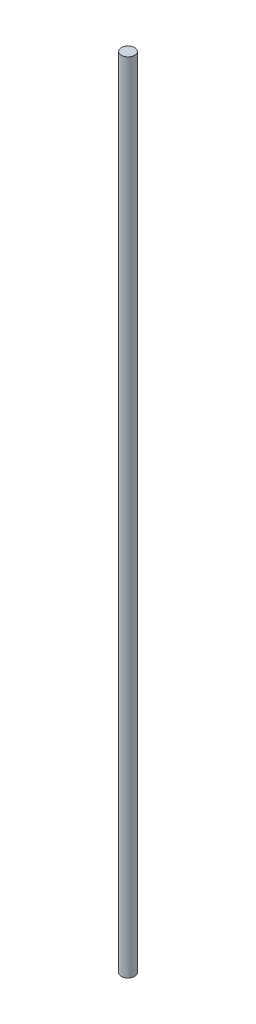
ISO-10303-21;
HEADER;
FILE_DESCRIPTION(('STEP AP214'),'2;1');
FILE_NAME('part.step','',(''),(''),'','','');
FILE_SCHEMA(('AUTOMOTIVE_DESIGN { 1 0 10303 214 1 1 1 1 }'));
ENDSEC;
DATA;
#1=APPLICATION_CONTEXT('core data for automotive mechanical design processes');
#2=APPLICATION_PROTOCOL_DEFINITION('international standard','automotive_design',2000,#1);
#3=PRODUCT_CONTEXT('',#1,'mechanical');
#4=PRODUCT('Part','Part','',(#3));
#5=PRODUCT_RELATED_PRODUCT_CATEGORY('part','',(#4));
#6=PRODUCT_DEFINITION_FORMATION('','',#4);
#7=PRODUCT_DEFINITION_CONTEXT('part definition',#1,'design');
#8=PRODUCT_DEFINITION('design','',#6,#7);
#9=PRODUCT_DEFINITION_SHAPE('','',#8);
#10=(LENGTH_UNIT() NAMED_UNIT(*) SI_UNIT(.MILLI.,.METRE.));
#11=(NAMED_UNIT(*) PLANE_ANGLE_UNIT() SI_UNIT($,.RADIAN.));
#12=(NAMED_UNIT(*) SI_UNIT($,.STERADIAN.) SOLID_ANGLE_UNIT());
#13=UNCERTAINTY_MEASURE_WITH_UNIT(LENGTH_MEASURE(1.E-05),#10,'distance_accuracy_value','');
#14=(GEOMETRIC_REPRESENTATION_CONTEXT(3) GLOBAL_UNCERTAINTY_ASSIGNED_CONTEXT((#13)) GLOBAL_UNIT_ASSIGNED_CONTEXT((#10,
#11,#12)) REPRESENTATION_CONTEXT('',''));
#15=CARTESIAN_POINT('',(0.,0.,0.));
#16=DIRECTION('',(0.,0.,1.));
#17=DIRECTION('',(1.,0.,0.));
#18=AXIS2_PLACEMENT_3D('',#15,#16,#17);
#19=CARTESIAN_POINT('',(0.,12.,0.));
#20=DIRECTION('',(0.,-1.,0.));
#21=DIRECTION('',(0.,0.,-1.));
#22=AXIS2_PLACEMENT_3D('',#19,#20,#21);
#23=CYLINDRICAL_SURFACE('',#22,0.1);
#24=CARTESIAN_POINT('',(0.,12.,0.));
#25=DIRECTION('',(0.,1.,0.));
#26=DIRECTION('',(0.,0.,1.));
#27=AXIS2_PLACEMENT_3D('',#24,#25,#26);
#28=CIRCLE('',#27,0.1);
#29=CARTESIAN_POINT('',(0.,12.,0.1));
#30=VERTEX_POINT('',#29);
#31=EDGE_CURVE('E12',#30,#30,#28,.T.);
#32=ORIENTED_EDGE('',*,*,#31,.F.);
#33=EDGE_LOOP('',(#32));
#34=FACE_BOUND('',#33,.T.);
#35=CARTESIAN_POINT('',(0.,0.,0.));
#36=DIRECTION('',(0.,1.,0.));
#37=DIRECTION('',(0.,0.,1.));
#38=AXIS2_PLACEMENT_3D('',#35,#36,#37);
#39=CIRCLE('',#38,0.1);
#40=CARTESIAN_POINT('',(0.,0.,0.1));
#41=VERTEX_POINT('',#40);
#42=EDGE_CURVE('E46',#41,#41,#39,.T.);
#43=ORIENTED_EDGE('',*,*,#42,.T.);
#44=EDGE_LOOP('',(#43));
#45=FACE_BOUND('',#44,.T.);
#46=ADVANCED_FACE('F43',(#34,#45),#23,.T.);
#47=CARTESIAN_POINT('',(0.,12.,0.));
#48=DIRECTION('',(0.,1.,0.));
#49=DIRECTION('',(0.,0.,1.));
#50=AXIS2_PLACEMENT_3D('',#47,#48,#49);
#51=PLANE('',#50);
#52=ORIENTED_EDGE('',*,*,#31,.T.);
#53=EDGE_LOOP('',(#52));
#54=FACE_BOUND('',#53,.T.);
#55=ADVANCED_FACE('F58',(#54),#51,.T.);
#56=CARTESIAN_POINT('',(0.,0.,0.));
#57=DIRECTION('',(0.,1.,0.));
#58=DIRECTION('',(0.,0.,1.));
#59=AXIS2_PLACEMENT_3D('',#56,#57,#58);
#60=PLANE('',#59);
#61=ORIENTED_EDGE('',*,*,#42,.F.);
#62=EDGE_LOOP('',(#61));
#63=FACE_BOUND('',#62,.T.);
#64=ADVANCED_FACE('F56',(#63),#60,.F.);
#65=CLOSED_SHELL('',(#46,#55,#64));
#66=MANIFOLD_SOLID_BREP('B2',#65);
#67=ADVANCED_BREP_SHAPE_REPRESENTATION('',(#18,#66),#14);
#68=SHAPE_DEFINITION_REPRESENTATION(#9,#67);
ENDSEC;
END-ISO-10303-21;
